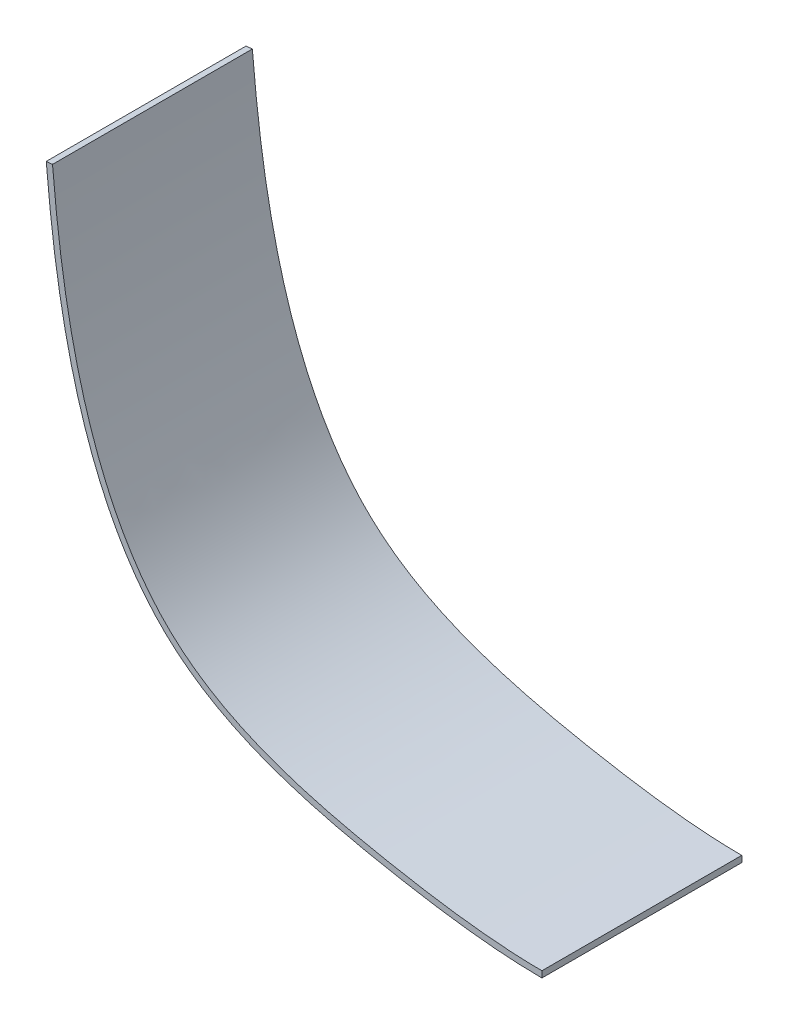
ISO-10303-21;
HEADER;
FILE_DESCRIPTION(('STEP AP214'),'2;1');
FILE_NAME('part.step','',(''),(''),'','','');
FILE_SCHEMA(('AUTOMOTIVE_DESIGN { 1 0 10303 214 1 1 1 1 }'));
ENDSEC;
DATA;
#1=APPLICATION_CONTEXT('core data for automotive mechanical design processes');
#2=APPLICATION_PROTOCOL_DEFINITION('international standard','automotive_design',2000,#1);
#3=PRODUCT_CONTEXT('',#1,'mechanical');
#4=PRODUCT('Part','Part','',(#3));
#5=PRODUCT_RELATED_PRODUCT_CATEGORY('part','',(#4));
#6=PRODUCT_DEFINITION_FORMATION('','',#4);
#7=PRODUCT_DEFINITION_CONTEXT('part definition',#1,'design');
#8=PRODUCT_DEFINITION('design','',#6,#7);
#9=PRODUCT_DEFINITION_SHAPE('','',#8);
#10=(LENGTH_UNIT() NAMED_UNIT(*) SI_UNIT(.MILLI.,.METRE.));
#11=(NAMED_UNIT(*) PLANE_ANGLE_UNIT() SI_UNIT($,.RADIAN.));
#12=(NAMED_UNIT(*) SI_UNIT($,.STERADIAN.) SOLID_ANGLE_UNIT());
#13=UNCERTAINTY_MEASURE_WITH_UNIT(LENGTH_MEASURE(1.E-05),#10,'distance_accuracy_value','');
#14=(GEOMETRIC_REPRESENTATION_CONTEXT(3) GLOBAL_UNCERTAINTY_ASSIGNED_CONTEXT((#13)) GLOBAL_UNIT_ASSIGNED_CONTEXT((#10,
#11,#12)) REPRESENTATION_CONTEXT('',''));
#15=CARTESIAN_POINT('',(0.,0.,0.));
#16=DIRECTION('',(0.,0.,1.));
#17=DIRECTION('',(1.,0.,0.));
#18=AXIS2_PLACEMENT_3D('',#15,#16,#17);
#19=CARTESIAN_POINT('',(-1.59427719835218,-0.137550917170006,50.8));
#20=CARTESIAN_POINT('',(-0.994097497400841,-7.09390447574289,50.8));
#21=CARTESIAN_POINT('',(-0.17364975111465,-14.9138671088433,50.8));
#22=CARTESIAN_POINT('',(2.35461319123408,-31.2041967507907,50.8));
#23=CARTESIAN_POINT('',(4.06205299980712,-39.6748990727661,50.8));
#24=CARTESIAN_POINT('',(8.82172206626691,-56.2031261606278,50.8));
#25=CARTESIAN_POINT('',(11.8731919952442,-64.2617156096809,50.8));
#26=CARTESIAN_POINT('',(17.8234117270752,-75.2403075269703,50.8));
#27=CARTESIAN_POINT('',(20.0360519151608,-78.7148851783402,50.8));
#28=CARTESIAN_POINT('',(23.7467797582606,-83.5448203185663,50.8));
#29=CARTESIAN_POINT('',(25.0489923599519,-85.091089010411,50.8));
#30=CARTESIAN_POINT('',(27.7917808791413,-88.0379846698898,50.8));
#31=CARTESIAN_POINT('',(29.2345103641197,-89.438364020997,50.8));
#32=CARTESIAN_POINT('',(33.7622271135738,-93.3925787765343,50.8));
#33=CARTESIAN_POINT('',(37.0404450516309,-95.7091708342377,50.8));
#34=CARTESIAN_POINT('',(43.9943124481286,-99.8091067736208,50.8));
#35=CARTESIAN_POINT('',(47.6700639917631,-101.592735963053,50.8));
#36=CARTESIAN_POINT('',(59.1240536359132,-106.307829927045,50.8));
#37=CARTESIAN_POINT('',(67.3291007235982,-108.605155371869,50.8));
#38=CARTESIAN_POINT('',(77.7564280278949,-110.945417866827,50.8));
#39=CARTESIAN_POINT('',(79.8504680062332,-111.386797483755,50.8));
#40=CARTESIAN_POINT('',(84.0421794236239,-112.229000028209,50.8));
#41=CARTESIAN_POINT('',(86.1394841198997,-112.631267405488,50.8));
#42=CARTESIAN_POINT('',(92.4273277523156,-113.78229019173,50.8));
#43=CARTESIAN_POINT('',(96.6107474565897,-114.470737301034,50.8));
#44=CARTESIAN_POINT('',(108.987957581704,-116.202191658898,50.8));
#45=CARTESIAN_POINT('',(117.007429536741,-116.912380770006,50.8));
#46=CARTESIAN_POINT('',(124.412018134535,-116.912380770006,50.8));
#47=B_SPLINE_CURVE_WITH_KNOTS('',3,(#19,#20,#21,#22,#23,#24,#25,#26,#27,#28,#29,#30,#31,#32,#33,
#34,#35,#36,#37,#38,#39,#40,#41,#42,#43,#44,#45,#46),.UNSPECIFIED.,.F.,.F.,(4,2,2,2,2,2,2,2,2,2,
2,2,2,4),(0.,0.125,0.250000000000001,0.375000000000001,0.437500000000001,0.468750000000001,
0.500000000000001,0.562500000000001,0.625000000000001,0.750000000000001,0.781250000000001,
0.812500000000001,0.875000000000001,1.),.UNSPECIFIED.);
#48=DIRECTION('',(0.,0.,-1.));
#49=VECTOR('',#48,1.);
#50=SURFACE_OF_LINEAR_EXTRUSION('',#47,#49);
#51=CARTESIAN_POINT('',(-1.59427719835218,-0.137550917170006,0.));
#52=CARTESIAN_POINT('',(-0.994097497400841,-7.09390447574289,0.));
#53=CARTESIAN_POINT('',(-0.17364975111465,-14.9138671088433,0.));
#54=CARTESIAN_POINT('',(2.35461319123408,-31.2041967507907,0.));
#55=CARTESIAN_POINT('',(4.06205299980712,-39.6748990727661,0.));
#56=CARTESIAN_POINT('',(8.82172206626691,-56.2031261606278,0.));
#57=CARTESIAN_POINT('',(11.8731919952442,-64.2617156096809,0.));
#58=CARTESIAN_POINT('',(17.8234117270752,-75.2403075269703,0.));
#59=CARTESIAN_POINT('',(20.0360519151608,-78.7148851783402,0.));
#60=CARTESIAN_POINT('',(23.7467797582606,-83.5448203185663,0.));
#61=CARTESIAN_POINT('',(25.0489923599519,-85.091089010411,0.));
#62=CARTESIAN_POINT('',(27.7917808791413,-88.0379846698898,0.));
#63=CARTESIAN_POINT('',(29.2345103641197,-89.438364020997,0.));
#64=CARTESIAN_POINT('',(33.7622271135738,-93.3925787765343,0.));
#65=CARTESIAN_POINT('',(37.0404450516309,-95.7091708342377,0.));
#66=CARTESIAN_POINT('',(43.9943124481286,-99.8091067736208,0.));
#67=CARTESIAN_POINT('',(47.6700639917631,-101.592735963053,0.));
#68=CARTESIAN_POINT('',(59.1240536359132,-106.307829927045,0.));
#69=CARTESIAN_POINT('',(67.3291007235982,-108.605155371869,0.));
#70=CARTESIAN_POINT('',(77.7564280278949,-110.945417866827,0.));
#71=CARTESIAN_POINT('',(79.8504680062332,-111.386797483755,0.));
#72=CARTESIAN_POINT('',(84.0421794236239,-112.229000028209,0.));
#73=CARTESIAN_POINT('',(86.1394841198997,-112.631267405488,0.));
#74=CARTESIAN_POINT('',(92.4273277523156,-113.78229019173,0.));
#75=CARTESIAN_POINT('',(96.6107474565897,-114.470737301034,0.));
#76=CARTESIAN_POINT('',(108.987957581704,-116.202191658898,0.));
#77=CARTESIAN_POINT('',(117.007429536741,-116.912380770006,0.));
#78=CARTESIAN_POINT('',(124.412018134535,-116.912380770006,0.));
#79=B_SPLINE_CURVE_WITH_KNOTS('',3,(#51,#52,#53,#54,#55,#56,#57,#58,#59,#60,#61,#62,#63,#64,#65,
#66,#67,#68,#69,#70,#71,#72,#73,#74,#75,#76,#77,#78),.UNSPECIFIED.,.F.,.F.,(4,2,2,2,2,2,2,2,2,2,
2,2,2,4),(0.,0.125,0.250000000000001,0.375000000000001,0.437500000000001,0.468750000000001,
0.500000000000001,0.562500000000001,0.625000000000001,0.750000000000001,0.781250000000001,
0.812500000000001,0.875000000000001,1.),.UNSPECIFIED.);
#80=CARTESIAN_POINT('',(-1.59427719835218,-0.137550917170006,0.));
#81=VERTEX_POINT('',#80);
#82=CARTESIAN_POINT('',(124.412018134535,-116.912380770006,0.));
#83=VERTEX_POINT('',#82);
#84=EDGE_CURVE('E113',#81,#83,#79,.T.);
#85=ORIENTED_EDGE('',*,*,#84,.T.);
#86=DIRECTION('',(0.,0.,-1.));
#87=VECTOR('',#86,1.);
#88=CARTESIAN_POINT('',(124.412018134535,-116.912380770006,50.8));
#89=LINE('',#88,#87);
#90=CARTESIAN_POINT('',(124.412018134535,-116.912380770006,50.8));
#91=VERTEX_POINT('',#90);
#92=EDGE_CURVE('E11',#91,#83,#89,.T.);
#93=ORIENTED_EDGE('',*,*,#92,.F.);
#94=CARTESIAN_POINT('',(-1.59427719835218,-0.137550917170006,50.8));
#95=VERTEX_POINT('',#94);
#96=EDGE_CURVE('E74',#95,#91,#47,.T.);
#97=ORIENTED_EDGE('',*,*,#96,.F.);
#98=DIRECTION('',(0.,0.,-1.));
#99=VECTOR('',#98,1.);
#100=CARTESIAN_POINT('',(-1.59427719835218,-0.137550917170006,50.8));
#101=LINE('',#100,#99);
#102=EDGE_CURVE('E50',#95,#81,#101,.T.);
#103=ORIENTED_EDGE('',*,*,#102,.T.);
#104=EDGE_LOOP('',(#85,#93,#97,#103));
#105=FACE_BOUND('',#104,.T.);
#106=ADVANCED_FACE('F33',(#105),#50,.F.);
#107=CARTESIAN_POINT('',(124.412018134535,-115.312180770006,50.8));
#108=DIRECTION('',(1.,0.,0.));
#109=DIRECTION('',(0.,0.,-1.));
#110=AXIS2_PLACEMENT_3D('',#107,#108,#109);
#111=PLANE('',#110);
#112=DIRECTION('',(0.,-1.,0.));
#113=VECTOR('',#112,1.);
#114=CARTESIAN_POINT('',(124.412018134535,-115.312180770006,0.));
#115=LINE('',#114,#113);
#116=CARTESIAN_POINT('',(124.412018134535,-115.312180770006,0.));
#117=VERTEX_POINT('',#116);
#118=EDGE_CURVE('E83',#117,#83,#115,.T.);
#119=ORIENTED_EDGE('',*,*,#118,.F.);
#120=DIRECTION('',(0.,0.,-1.));
#121=VECTOR('',#120,1.);
#122=CARTESIAN_POINT('',(124.412018134535,-115.312180770006,50.8));
#123=LINE('',#122,#121);
#124=CARTESIAN_POINT('',(124.412018134535,-115.312180770006,50.8));
#125=VERTEX_POINT('',#124);
#126=EDGE_CURVE('E42',#125,#117,#123,.T.);
#127=ORIENTED_EDGE('',*,*,#126,.F.);
#128=DIRECTION('',(0.,-1.,0.));
#129=VECTOR('',#128,1.);
#130=CARTESIAN_POINT('',(124.412018134535,-115.312180770006,50.8));
#131=LINE('',#130,#129);
#132=EDGE_CURVE('E81',#125,#91,#131,.T.);
#133=ORIENTED_EDGE('',*,*,#132,.T.);
#134=ORIENTED_EDGE('',*,*,#92,.T.);
#135=EDGE_LOOP('',(#119,#127,#133,#134));
#136=FACE_BOUND('',#135,.T.);
#137=ADVANCED_FACE('F80',(#136),#111,.T.);
#138=CARTESIAN_POINT('',(0.,0.,50.8));
#139=CARTESIAN_POINT('',(2.33806752901971,-27.0992576888209,50.8));
#140=CARTESIAN_POINT('',(11.5648541239303,-92.2053175294095,50.8));
#141=CARTESIAN_POINT('',(78.081353630823,-110.568650662092,50.8));
#142=CARTESIAN_POINT('',(112.354193505602,-115.312180770006,50.8));
#143=CARTESIAN_POINT('',(124.412018134535,-115.312180770006,50.8));
#144=B_SPLINE_CURVE_WITH_KNOTS('',3,(#138,#139,#140,#141,#142,#143),.UNSPECIFIED.,.F.,.F.,(4,1,
1,4),(0.,0.488505924840112,0.793587712721212,1.),.UNSPECIFIED.);
#145=DIRECTION('',(0.,0.,-1.));
#146=VECTOR('',#145,1.);
#147=SURFACE_OF_LINEAR_EXTRUSION('',#144,#146);
#148=CARTESIAN_POINT('',(0.,0.,0.));
#149=CARTESIAN_POINT('',(2.33806752901971,-27.0992576888209,0.));
#150=CARTESIAN_POINT('',(11.5648541239303,-92.2053175294095,0.));
#151=CARTESIAN_POINT('',(78.081353630823,-110.568650662092,0.));
#152=CARTESIAN_POINT('',(112.354193505602,-115.312180770006,0.));
#153=CARTESIAN_POINT('',(124.412018134535,-115.312180770006,0.));
#154=B_SPLINE_CURVE_WITH_KNOTS('',3,(#148,#149,#150,#151,#152,#153),.UNSPECIFIED.,.F.,.F.,(4,1,
1,4),(0.,0.488505924840112,0.793587712721212,1.),.UNSPECIFIED.);
#155=CARTESIAN_POINT('',(0.,0.,0.));
#156=VERTEX_POINT('',#155);
#157=EDGE_CURVE('E117',#156,#117,#154,.T.);
#158=ORIENTED_EDGE('',*,*,#157,.F.);
#159=DIRECTION('',(0.,0.,-1.));
#160=VECTOR('',#159,1.);
#161=CARTESIAN_POINT('',(0.,0.,50.8));
#162=LINE('',#161,#160);
#163=CARTESIAN_POINT('',(0.,0.,50.8));
#164=VERTEX_POINT('',#163);
#165=EDGE_CURVE('E63',#164,#156,#162,.T.);
#166=ORIENTED_EDGE('',*,*,#165,.F.);
#167=EDGE_CURVE('E89',#164,#125,#144,.T.);
#168=ORIENTED_EDGE('',*,*,#167,.T.);
#169=ORIENTED_EDGE('',*,*,#126,.T.);
#170=EDGE_LOOP('',(#158,#166,#168,#169));
#171=FACE_BOUND('',#170,.T.);
#172=ADVANCED_FACE('F91',(#171),#147,.T.);
#173=CARTESIAN_POINT('',(-1.59427719835218,-0.137550917170006,50.8));
#174=DIRECTION('',(-0.0859585784089548,0.996298711631161,0.));
#175=DIRECTION('',(-0.996298711631161,-0.0859585784089548,0.));
#176=AXIS2_PLACEMENT_3D('',#173,#174,#175);
#177=PLANE('',#176);
#178=DIRECTION('',(0.996298711631161,0.0859585784089548,0.));
#179=VECTOR('',#178,1.);
#180=CARTESIAN_POINT('',(-1.59427719835218,-0.137550917170006,0.));
#181=LINE('',#180,#179);
#182=EDGE_CURVE('E119',#81,#156,#181,.T.);
#183=ORIENTED_EDGE('',*,*,#182,.F.);
#184=ORIENTED_EDGE('',*,*,#102,.F.);
#185=DIRECTION('',(0.996298711631161,0.0859585784089548,0.));
#186=VECTOR('',#185,1.);
#187=CARTESIAN_POINT('',(-1.59427719835218,-0.137550917170006,50.8));
#188=LINE('',#187,#186);
#189=EDGE_CURVE('E92',#95,#164,#188,.T.);
#190=ORIENTED_EDGE('',*,*,#189,.T.);
#191=ORIENTED_EDGE('',*,*,#165,.T.);
#192=EDGE_LOOP('',(#183,#184,#190,#191));
#193=FACE_BOUND('',#192,.T.);
#194=ADVANCED_FACE('F105',(#193),#177,.T.);
#195=CARTESIAN_POINT('',(30.7437492806042,-90.7564356061759,50.8));
#196=DIRECTION('',(0.,0.,-1.));
#197=DIRECTION('',(-1.,0.,0.));
#198=AXIS2_PLACEMENT_3D('',#195,#196,#197);
#199=PLANE('',#198);
#200=ORIENTED_EDGE('',*,*,#96,.T.);
#201=ORIENTED_EDGE('',*,*,#132,.F.);
#202=ORIENTED_EDGE('',*,*,#167,.F.);
#203=ORIENTED_EDGE('',*,*,#189,.F.);
#204=EDGE_LOOP('',(#200,#201,#202,#203));
#205=FACE_BOUND('',#204,.T.);
#206=ADVANCED_FACE('F88',(#205),#199,.F.);
#207=CARTESIAN_POINT('',(30.7437492806042,-90.7564356061759,0.));
#208=DIRECTION('',(0.,0.,-1.));
#209=DIRECTION('',(-1.,0.,0.));
#210=AXIS2_PLACEMENT_3D('',#207,#208,#209);
#211=PLANE('',#210);
#212=ORIENTED_EDGE('',*,*,#84,.F.);
#213=ORIENTED_EDGE('',*,*,#182,.T.);
#214=ORIENTED_EDGE('',*,*,#157,.T.);
#215=ORIENTED_EDGE('',*,*,#118,.T.);
#216=EDGE_LOOP('',(#212,#213,#214,#215));
#217=FACE_BOUND('',#216,.T.);
#218=ADVANCED_FACE('F116',(#217),#211,.T.);
#219=CLOSED_SHELL('',(#106,#137,#172,#194,#206,#218));
#220=MANIFOLD_SOLID_BREP('B2',#219);
#221=ADVANCED_BREP_SHAPE_REPRESENTATION('',(#18,#220),#14);
#222=SHAPE_DEFINITION_REPRESENTATION(#9,#221);
ENDSEC;
END-ISO-10303-21;
